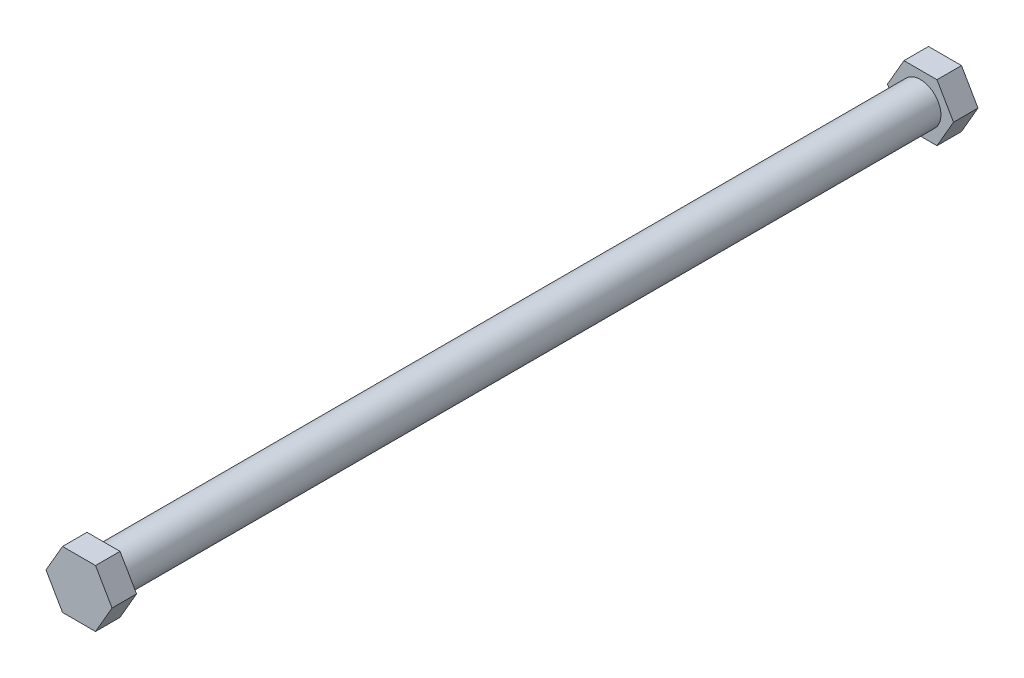
ISO-10303-21;
HEADER;
FILE_DESCRIPTION(('STEP AP214'),'2;1');
FILE_NAME('part.step','',(''),(''),'','','');
FILE_SCHEMA(('AUTOMOTIVE_DESIGN { 1 0 10303 214 1 1 1 1 }'));
ENDSEC;
DATA;
#1=APPLICATION_CONTEXT('core data for automotive mechanical design processes');
#2=APPLICATION_PROTOCOL_DEFINITION('international standard','automotive_design',2000,#1);
#3=PRODUCT_CONTEXT('',#1,'mechanical');
#4=PRODUCT('Part','Part','',(#3));
#5=PRODUCT_RELATED_PRODUCT_CATEGORY('part','',(#4));
#6=PRODUCT_DEFINITION_FORMATION('','',#4);
#7=PRODUCT_DEFINITION_CONTEXT('part definition',#1,'design');
#8=PRODUCT_DEFINITION('design','',#6,#7);
#9=PRODUCT_DEFINITION_SHAPE('','',#8);
#10=(LENGTH_UNIT() NAMED_UNIT(*) SI_UNIT(.MILLI.,.METRE.));
#11=(NAMED_UNIT(*) PLANE_ANGLE_UNIT() SI_UNIT($,.RADIAN.));
#12=(NAMED_UNIT(*) SI_UNIT($,.STERADIAN.) SOLID_ANGLE_UNIT());
#13=UNCERTAINTY_MEASURE_WITH_UNIT(LENGTH_MEASURE(1.E-05),#10,'distance_accuracy_value','');
#14=(GEOMETRIC_REPRESENTATION_CONTEXT(3) GLOBAL_UNCERTAINTY_ASSIGNED_CONTEXT((#13)) GLOBAL_UNIT_ASSIGNED_CONTEXT((#10,
#11,#12)) REPRESENTATION_CONTEXT('',''));
#15=CARTESIAN_POINT('',(0.,0.,0.));
#16=DIRECTION('',(0.,0.,1.));
#17=DIRECTION('',(1.,0.,0.));
#18=AXIS2_PLACEMENT_3D('',#15,#16,#17);
#19=CARTESIAN_POINT('',(0.,0.,100.));
#20=DIRECTION('',(0.,0.,-1.));
#21=DIRECTION('',(-1.,0.,0.));
#22=AXIS2_PLACEMENT_3D('',#19,#20,#21);
#23=CYLINDRICAL_SURFACE('',#22,2.5);
#24=CARTESIAN_POINT('',(0.,0.,100.));
#25=DIRECTION('',(0.,0.,1.));
#26=DIRECTION('',(1.,0.,0.));
#27=AXIS2_PLACEMENT_3D('',#24,#25,#26);
#28=CIRCLE('',#27,2.5);
#29=CARTESIAN_POINT('',(2.5,0.,100.));
#30=VERTEX_POINT('',#29);
#31=EDGE_CURVE('E11',#30,#30,#28,.T.);
#32=ORIENTED_EDGE('',*,*,#31,.F.);
#33=EDGE_LOOP('',(#32));
#34=FACE_BOUND('',#33,.T.);
#35=CARTESIAN_POINT('',(0.,0.,0.));
#36=DIRECTION('',(0.,0.,1.));
#37=DIRECTION('',(1.,0.,0.));
#38=AXIS2_PLACEMENT_3D('',#35,#36,#37);
#39=CIRCLE('',#38,2.5);
#40=CARTESIAN_POINT('',(2.5,0.,0.));
#41=VERTEX_POINT('',#40);
#42=EDGE_CURVE('E42',#41,#41,#39,.T.);
#43=ORIENTED_EDGE('',*,*,#42,.T.);
#44=EDGE_LOOP('',(#43));
#45=FACE_BOUND('',#44,.T.);
#46=ADVANCED_FACE('F39',(#34,#45),#23,.T.);
#47=CARTESIAN_POINT('',(4.04145188432738,0.,-3.));
#48=DIRECTION('',(0.866025403784438,0.5,0.));
#49=DIRECTION('',(-0.5,0.866025403784439,0.));
#50=AXIS2_PLACEMENT_3D('',#47,#48,#49);
#51=PLANE('',#50);
#52=DIRECTION('',(-0.5,0.866025403784439,0.));
#53=VECTOR('',#52,1.);
#54=CARTESIAN_POINT('',(4.04145188432738,0.,0.));
#55=LINE('',#54,#53);
#56=CARTESIAN_POINT('',(4.04145188432738,0.,0.));
#57=VERTEX_POINT('',#56);
#58=CARTESIAN_POINT('',(2.02072594216369,3.5,0.));
#59=VERTEX_POINT('',#58);
#60=EDGE_CURVE('E136',#57,#59,#55,.T.);
#61=ORIENTED_EDGE('',*,*,#60,.F.);
#62=DIRECTION('',(0.,0.,1.));
#63=VECTOR('',#62,1.);
#64=CARTESIAN_POINT('',(4.04145188432738,0.,-3.));
#65=LINE('',#64,#63);
#66=CARTESIAN_POINT('',(4.04145188432738,0.,-3.));
#67=VERTEX_POINT('',#66);
#68=EDGE_CURVE('E56',#67,#57,#65,.T.);
#69=ORIENTED_EDGE('',*,*,#68,.F.);
#70=DIRECTION('',(-0.5,0.866025403784439,0.));
#71=VECTOR('',#70,1.);
#72=CARTESIAN_POINT('',(4.04145188432738,0.,-3.));
#73=LINE('',#72,#71);
#74=CARTESIAN_POINT('',(2.02072594216369,3.5,-3.));
#75=VERTEX_POINT('',#74);
#76=EDGE_CURVE('E158',#67,#75,#73,.T.);
#77=ORIENTED_EDGE('',*,*,#76,.T.);
#78=DIRECTION('',(0.,0.,1.));
#79=VECTOR('',#78,1.);
#80=CARTESIAN_POINT('',(2.02072594216369,3.5,-3.));
#81=LINE('',#80,#79);
#82=EDGE_CURVE('E92',#75,#59,#81,.T.);
#83=ORIENTED_EDGE('',*,*,#82,.T.);
#84=EDGE_LOOP('',(#61,#69,#77,#83));
#85=FACE_BOUND('',#84,.T.);
#86=ADVANCED_FACE('F169',(#85),#51,.T.);
#87=CARTESIAN_POINT('',(2.02072594216369,-3.5,-3.));
#88=DIRECTION('',(0.866025403784439,-0.499999999999999,0.));
#89=DIRECTION('',(0.5,0.866025403784439,0.));
#90=AXIS2_PLACEMENT_3D('',#87,#88,#89);
#91=PLANE('',#90);
#92=DIRECTION('',(0.5,0.866025403784439,0.));
#93=VECTOR('',#92,1.);
#94=CARTESIAN_POINT('',(2.02072594216369,-3.5,0.));
#95=LINE('',#94,#93);
#96=CARTESIAN_POINT('',(2.02072594216369,-3.5,0.));
#97=VERTEX_POINT('',#96);
#98=EDGE_CURVE('E154',#97,#57,#95,.T.);
#99=ORIENTED_EDGE('',*,*,#98,.F.);
#100=DIRECTION('',(0.,0.,1.));
#101=VECTOR('',#100,1.);
#102=CARTESIAN_POINT('',(2.02072594216369,-3.5,-3.));
#103=LINE('',#102,#101);
#104=CARTESIAN_POINT('',(2.02072594216369,-3.5,-3.));
#105=VERTEX_POINT('',#104);
#106=EDGE_CURVE('E80',#105,#97,#103,.T.);
#107=ORIENTED_EDGE('',*,*,#106,.F.);
#108=DIRECTION('',(0.5,0.866025403784439,0.));
#109=VECTOR('',#108,1.);
#110=CARTESIAN_POINT('',(2.02072594216369,-3.5,-3.));
#111=LINE('',#110,#109);
#112=EDGE_CURVE('E122',#105,#67,#111,.T.);
#113=ORIENTED_EDGE('',*,*,#112,.T.);
#114=ORIENTED_EDGE('',*,*,#68,.T.);
#115=EDGE_LOOP('',(#99,#107,#113,#114));
#116=FACE_BOUND('',#115,.T.);
#117=ADVANCED_FACE('F174',(#116),#91,.T.);
#118=CARTESIAN_POINT('',(-2.02072594216369,-3.5,-3.));
#119=DIRECTION('',(0.,-1.,0.));
#120=DIRECTION('',(1.,0.,0.));
#121=AXIS2_PLACEMENT_3D('',#118,#119,#120);
#122=PLANE('',#121);
#123=DIRECTION('',(1.,0.,0.));
#124=VECTOR('',#123,1.);
#125=CARTESIAN_POINT('',(-2.02072594216369,-3.5,0.));
#126=LINE('',#125,#124);
#127=CARTESIAN_POINT('',(-2.02072594216369,-3.5,0.));
#128=VERTEX_POINT('',#127);
#129=EDGE_CURVE('E108',#128,#97,#126,.T.);
#130=ORIENTED_EDGE('',*,*,#129,.F.);
#131=DIRECTION('',(0.,0.,1.));
#132=VECTOR('',#131,1.);
#133=CARTESIAN_POINT('',(-2.02072594216369,-3.5,-3.));
#134=LINE('',#133,#132);
#135=CARTESIAN_POINT('',(-2.02072594216369,-3.5,-3.));
#136=VERTEX_POINT('',#135);
#137=EDGE_CURVE('E103',#136,#128,#134,.T.);
#138=ORIENTED_EDGE('',*,*,#137,.F.);
#139=DIRECTION('',(1.,0.,0.));
#140=VECTOR('',#139,1.);
#141=CARTESIAN_POINT('',(-2.02072594216369,-3.5,-3.));
#142=LINE('',#141,#140);
#143=EDGE_CURVE('E106',#136,#105,#142,.T.);
#144=ORIENTED_EDGE('',*,*,#143,.T.);
#145=ORIENTED_EDGE('',*,*,#106,.T.);
#146=EDGE_LOOP('',(#130,#138,#144,#145));
#147=FACE_BOUND('',#146,.T.);
#148=ADVANCED_FACE('F105',(#147),#122,.T.);
#149=CARTESIAN_POINT('',(-4.04145188432738,0.,-3.));
#150=DIRECTION('',(-0.866025403784439,-0.5,0.));
#151=DIRECTION('',(0.5,-0.866025403784439,0.));
#152=AXIS2_PLACEMENT_3D('',#149,#150,#151);
#153=PLANE('',#152);
#154=DIRECTION('',(0.5,-0.866025403784439,0.));
#155=VECTOR('',#154,1.);
#156=CARTESIAN_POINT('',(-4.04145188432738,0.,0.));
#157=LINE('',#156,#155);
#158=CARTESIAN_POINT('',(-4.04145188432738,0.,0.));
#159=VERTEX_POINT('',#158);
#160=EDGE_CURVE('E149',#159,#128,#157,.T.);
#161=ORIENTED_EDGE('',*,*,#160,.F.);
#162=DIRECTION('',(0.,0.,1.));
#163=VECTOR('',#162,1.);
#164=CARTESIAN_POINT('',(-4.04145188432738,0.,-3.));
#165=LINE('',#164,#163);
#166=CARTESIAN_POINT('',(-4.04145188432738,0.,-3.));
#167=VERTEX_POINT('',#166);
#168=EDGE_CURVE('E114',#167,#159,#165,.T.);
#169=ORIENTED_EDGE('',*,*,#168,.F.);
#170=DIRECTION('',(0.5,-0.866025403784439,0.));
#171=VECTOR('',#170,1.);
#172=CARTESIAN_POINT('',(-4.04145188432738,0.,-3.));
#173=LINE('',#172,#171);
#174=EDGE_CURVE('E120',#167,#136,#173,.T.);
#175=ORIENTED_EDGE('',*,*,#174,.T.);
#176=ORIENTED_EDGE('',*,*,#137,.T.);
#177=EDGE_LOOP('',(#161,#169,#175,#176));
#178=FACE_BOUND('',#177,.T.);
#179=ADVANCED_FACE('F125',(#178),#153,.T.);
#180=CARTESIAN_POINT('',(-2.02072594216369,3.5,-3.));
#181=DIRECTION('',(-0.866025403784439,0.5,0.));
#182=DIRECTION('',(-0.5,-0.866025403784439,0.));
#183=AXIS2_PLACEMENT_3D('',#180,#181,#182);
#184=PLANE('',#183);
#185=DIRECTION('',(-0.5,-0.866025403784439,0.));
#186=VECTOR('',#185,1.);
#187=CARTESIAN_POINT('',(-2.02072594216369,3.5,0.));
#188=LINE('',#187,#186);
#189=CARTESIAN_POINT('',(-2.02072594216369,3.5,0.));
#190=VERTEX_POINT('',#189);
#191=EDGE_CURVE('E145',#190,#159,#188,.T.);
#192=ORIENTED_EDGE('',*,*,#191,.F.);
#193=DIRECTION('',(0.,0.,1.));
#194=VECTOR('',#193,1.);
#195=CARTESIAN_POINT('',(-2.02072594216369,3.5,-3.));
#196=LINE('',#195,#194);
#197=CARTESIAN_POINT('',(-2.02072594216369,3.5,-3.));
#198=VERTEX_POINT('',#197);
#199=EDGE_CURVE('E165',#198,#190,#196,.T.);
#200=ORIENTED_EDGE('',*,*,#199,.F.);
#201=DIRECTION('',(-0.5,-0.866025403784439,0.));
#202=VECTOR('',#201,1.);
#203=CARTESIAN_POINT('',(-2.02072594216369,3.5,-3.));
#204=LINE('',#203,#202);
#205=EDGE_CURVE('E127',#198,#167,#204,.T.);
#206=ORIENTED_EDGE('',*,*,#205,.T.);
#207=ORIENTED_EDGE('',*,*,#168,.T.);
#208=EDGE_LOOP('',(#192,#200,#206,#207));
#209=FACE_BOUND('',#208,.T.);
#210=ADVANCED_FACE('F311',(#209),#184,.T.);
#211=CARTESIAN_POINT('',(2.02072594216369,3.5,-3.));
#212=DIRECTION('',(0.,1.,0.));
#213=DIRECTION('',(0.,0.,1.));
#214=AXIS2_PLACEMENT_3D('',#211,#212,#213);
#215=PLANE('',#214);
#216=DIRECTION('',(-1.,0.,0.));
#217=VECTOR('',#216,1.);
#218=CARTESIAN_POINT('',(2.02072594216369,3.5,0.));
#219=LINE('',#218,#217);
#220=EDGE_CURVE('E140',#59,#190,#219,.T.);
#221=ORIENTED_EDGE('',*,*,#220,.F.);
#222=ORIENTED_EDGE('',*,*,#82,.F.);
#223=DIRECTION('',(-1.,0.,0.));
#224=VECTOR('',#223,1.);
#225=CARTESIAN_POINT('',(2.02072594216369,3.5,-3.));
#226=LINE('',#225,#224);
#227=EDGE_CURVE('E130',#75,#198,#226,.T.);
#228=ORIENTED_EDGE('',*,*,#227,.T.);
#229=ORIENTED_EDGE('',*,*,#199,.T.);
#230=EDGE_LOOP('',(#221,#222,#228,#229));
#231=FACE_BOUND('',#230,.T.);
#232=ADVANCED_FACE('F170',(#231),#215,.T.);
#233=CARTESIAN_POINT('',(0.,0.,-3.));
#234=DIRECTION('',(0.,0.,1.));
#235=DIRECTION('',(1.,0.,0.));
#236=AXIS2_PLACEMENT_3D('',#233,#234,#235);
#237=PLANE('',#236);
#238=ORIENTED_EDGE('',*,*,#76,.F.);
#239=ORIENTED_EDGE('',*,*,#112,.F.);
#240=ORIENTED_EDGE('',*,*,#143,.F.);
#241=ORIENTED_EDGE('',*,*,#174,.F.);
#242=ORIENTED_EDGE('',*,*,#205,.F.);
#243=ORIENTED_EDGE('',*,*,#227,.F.);
#244=EDGE_LOOP('',(#238,#239,#240,#241,#242,#243));
#245=FACE_BOUND('',#244,.T.);
#246=ADVANCED_FACE('F118',(#245),#237,.F.);
#247=CARTESIAN_POINT('',(0.,0.,0.));
#248=DIRECTION('',(0.,0.,1.));
#249=DIRECTION('',(1.,0.,0.));
#250=AXIS2_PLACEMENT_3D('',#247,#248,#249);
#251=PLANE('',#250);
#252=ORIENTED_EDGE('',*,*,#42,.F.);
#253=EDGE_LOOP('',(#252));
#254=FACE_BOUND('',#253,.T.);
#255=ORIENTED_EDGE('',*,*,#60,.T.);
#256=ORIENTED_EDGE('',*,*,#220,.T.);
#257=ORIENTED_EDGE('',*,*,#191,.T.);
#258=ORIENTED_EDGE('',*,*,#160,.T.);
#259=ORIENTED_EDGE('',*,*,#129,.T.);
#260=ORIENTED_EDGE('',*,*,#98,.T.);
#261=EDGE_LOOP('',(#255,#256,#257,#258,#259,#260));
#262=FACE_BOUND('',#261,.T.);
#263=ADVANCED_FACE('F173',(#254,#262),#251,.T.);
#264=CARTESIAN_POINT('',(3.03108891324554,1.75,103.));
#265=DIRECTION('',(0.866025403784438,0.5,0.));
#266=DIRECTION('',(-0.5,0.866025403784439,0.));
#267=AXIS2_PLACEMENT_3D('',#264,#265,#266);
#268=PLANE('',#267);
#269=DIRECTION('',(0.5,-0.866025403784439,0.));
#270=VECTOR('',#269,1.);
#271=CARTESIAN_POINT('',(3.03108891324554,1.75,100.));
#272=LINE('',#271,#270);
#273=CARTESIAN_POINT('',(2.02072594216369,3.5,100.));
#274=VERTEX_POINT('',#273);
#275=CARTESIAN_POINT('',(4.04145188432738,0.,100.));
#276=VERTEX_POINT('',#275);
#277=EDGE_CURVE('E270',#274,#276,#272,.T.);
#278=ORIENTED_EDGE('',*,*,#277,.F.);
#279=DIRECTION('',(0.,0.,-1.));
#280=VECTOR('',#279,1.);
#281=CARTESIAN_POINT('',(2.02072594216369,3.5,103.));
#282=LINE('',#281,#280);
#283=CARTESIAN_POINT('',(2.02072594216369,3.5,103.));
#284=VERTEX_POINT('',#283);
#285=EDGE_CURVE('E141',#284,#274,#282,.T.);
#286=ORIENTED_EDGE('',*,*,#285,.F.);
#287=DIRECTION('',(0.5,-0.866025403784439,0.));
#288=VECTOR('',#287,1.);
#289=CARTESIAN_POINT('',(3.03108891324554,1.75,103.));
#290=LINE('',#289,#288);
#291=CARTESIAN_POINT('',(4.04145188432738,0.,103.));
#292=VERTEX_POINT('',#291);
#293=EDGE_CURVE('E236',#284,#292,#290,.T.);
#294=ORIENTED_EDGE('',*,*,#293,.T.);
#295=DIRECTION('',(0.,0.,-1.));
#296=VECTOR('',#295,1.);
#297=CARTESIAN_POINT('',(4.04145188432738,0.,103.));
#298=LINE('',#297,#296);
#299=EDGE_CURVE('E259',#292,#276,#298,.T.);
#300=ORIENTED_EDGE('',*,*,#299,.T.);
#301=EDGE_LOOP('',(#278,#286,#294,#300));
#302=FACE_BOUND('',#301,.T.);
#303=ADVANCED_FACE('F194',(#302),#268,.T.);
#304=CARTESIAN_POINT('',(0.,3.5,103.));
#305=DIRECTION('',(0.,1.,0.));
#306=DIRECTION('',(0.,0.,1.));
#307=AXIS2_PLACEMENT_3D('',#304,#305,#306);
#308=PLANE('',#307);
#309=DIRECTION('',(1.,0.,0.));
#310=VECTOR('',#309,1.);
#311=CARTESIAN_POINT('',(0.,3.5,100.));
#312=LINE('',#311,#310);
#313=CARTESIAN_POINT('',(-2.02072594216369,3.5,100.));
#314=VERTEX_POINT('',#313);
#315=EDGE_CURVE('E249',#314,#274,#312,.T.);
#316=ORIENTED_EDGE('',*,*,#315,.F.);
#317=DIRECTION('',(0.,0.,-1.));
#318=VECTOR('',#317,1.);
#319=CARTESIAN_POINT('',(-2.02072594216369,3.5,103.));
#320=LINE('',#319,#318);
#321=CARTESIAN_POINT('',(-2.02072594216369,3.5,103.));
#322=VERTEX_POINT('',#321);
#323=EDGE_CURVE('E256',#322,#314,#320,.T.);
#324=ORIENTED_EDGE('',*,*,#323,.F.);
#325=DIRECTION('',(1.,0.,0.));
#326=VECTOR('',#325,1.);
#327=CARTESIAN_POINT('',(0.,3.5,103.));
#328=LINE('',#327,#326);
#329=EDGE_CURVE('E240',#322,#284,#328,.T.);
#330=ORIENTED_EDGE('',*,*,#329,.T.);
#331=ORIENTED_EDGE('',*,*,#285,.T.);
#332=EDGE_LOOP('',(#316,#324,#330,#331));
#333=FACE_BOUND('',#332,.T.);
#334=ADVANCED_FACE('F199',(#333),#308,.T.);
#335=CARTESIAN_POINT('',(-3.03108891324554,1.75,103.));
#336=DIRECTION('',(-0.866025403784439,0.5,0.));
#337=DIRECTION('',(-0.5,-0.866025403784439,0.));
#338=AXIS2_PLACEMENT_3D('',#335,#336,#337);
#339=PLANE('',#338);
#340=DIRECTION('',(0.5,0.866025403784439,0.));
#341=VECTOR('',#340,1.);
#342=CARTESIAN_POINT('',(-3.03108891324554,1.75,100.));
#343=LINE('',#342,#341);
#344=CARTESIAN_POINT('',(-4.04145188432738,0.,100.));
#345=VERTEX_POINT('',#344);
#346=EDGE_CURVE('E286',#345,#314,#343,.T.);
#347=ORIENTED_EDGE('',*,*,#346,.F.);
#348=DIRECTION('',(0.,0.,-1.));
#349=VECTOR('',#348,1.);
#350=CARTESIAN_POINT('',(-4.04145188432738,0.,103.));
#351=LINE('',#350,#349);
#352=CARTESIAN_POINT('',(-4.04145188432738,0.,103.));
#353=VERTEX_POINT('',#352);
#354=EDGE_CURVE('E297',#353,#345,#351,.T.);
#355=ORIENTED_EDGE('',*,*,#354,.F.);
#356=DIRECTION('',(0.5,0.866025403784439,0.));
#357=VECTOR('',#356,1.);
#358=CARTESIAN_POINT('',(-3.03108891324554,1.75,103.));
#359=LINE('',#358,#357);
#360=EDGE_CURVE('E260',#353,#322,#359,.T.);
#361=ORIENTED_EDGE('',*,*,#360,.T.);
#362=ORIENTED_EDGE('',*,*,#323,.T.);
#363=EDGE_LOOP('',(#347,#355,#361,#362));
#364=FACE_BOUND('',#363,.T.);
#365=ADVANCED_FACE('F216',(#364),#339,.T.);
#366=CARTESIAN_POINT('',(-3.03108891324554,-1.75,103.));
#367=DIRECTION('',(-0.866025403784438,-0.5,0.));
#368=DIRECTION('',(0.5,-0.866025403784439,0.));
#369=AXIS2_PLACEMENT_3D('',#366,#367,#368);
#370=PLANE('',#369);
#371=DIRECTION('',(-0.5,0.866025403784439,0.));
#372=VECTOR('',#371,1.);
#373=CARTESIAN_POINT('',(-3.03108891324554,-1.75,100.));
#374=LINE('',#373,#372);
#375=CARTESIAN_POINT('',(-2.02072594216369,-3.5,100.));
#376=VERTEX_POINT('',#375);
#377=EDGE_CURVE('E282',#376,#345,#374,.T.);
#378=ORIENTED_EDGE('',*,*,#377,.F.);
#379=DIRECTION('',(0.,0.,-1.));
#380=VECTOR('',#379,1.);
#381=CARTESIAN_POINT('',(-2.02072594216369,-3.5,103.));
#382=LINE('',#381,#380);
#383=CARTESIAN_POINT('',(-2.02072594216369,-3.5,103.));
#384=VERTEX_POINT('',#383);
#385=EDGE_CURVE('E301',#384,#376,#382,.T.);
#386=ORIENTED_EDGE('',*,*,#385,.F.);
#387=DIRECTION('',(-0.5,0.866025403784439,0.));
#388=VECTOR('',#387,1.);
#389=CARTESIAN_POINT('',(-3.03108891324554,-1.75,103.));
#390=LINE('',#389,#388);
#391=EDGE_CURVE('E266',#384,#353,#390,.T.);
#392=ORIENTED_EDGE('',*,*,#391,.T.);
#393=ORIENTED_EDGE('',*,*,#354,.T.);
#394=EDGE_LOOP('',(#378,#386,#392,#393));
#395=FACE_BOUND('',#394,.T.);
#396=ADVANCED_FACE('F212',(#395),#370,.T.);
#397=CARTESIAN_POINT('',(0.,-3.5,103.));
#398=DIRECTION('',(0.,-1.,0.));
#399=DIRECTION('',(1.,0.,0.));
#400=AXIS2_PLACEMENT_3D('',#397,#398,#399);
#401=PLANE('',#400);
#402=DIRECTION('',(-1.,0.,0.));
#403=VECTOR('',#402,1.);
#404=CARTESIAN_POINT('',(0.,-3.5,100.));
#405=LINE('',#404,#403);
#406=CARTESIAN_POINT('',(2.02072594216369,-3.5,100.));
#407=VERTEX_POINT('',#406);
#408=EDGE_CURVE('E278',#407,#376,#405,.T.);
#409=ORIENTED_EDGE('',*,*,#408,.F.);
#410=DIRECTION('',(0.,0.,-1.));
#411=VECTOR('',#410,1.);
#412=CARTESIAN_POINT('',(2.02072594216369,-3.5,103.));
#413=LINE('',#412,#411);
#414=CARTESIAN_POINT('',(2.02072594216369,-3.5,103.));
#415=VERTEX_POINT('',#414);
#416=EDGE_CURVE('E264',#415,#407,#413,.T.);
#417=ORIENTED_EDGE('',*,*,#416,.F.);
#418=DIRECTION('',(-1.,0.,0.));
#419=VECTOR('',#418,1.);
#420=CARTESIAN_POINT('',(0.,-3.5,103.));
#421=LINE('',#420,#419);
#422=EDGE_CURVE('E441',#415,#384,#421,.T.);
#423=ORIENTED_EDGE('',*,*,#422,.T.);
#424=ORIENTED_EDGE('',*,*,#385,.T.);
#425=EDGE_LOOP('',(#409,#417,#423,#424));
#426=FACE_BOUND('',#425,.T.);
#427=ADVANCED_FACE('F208',(#426),#401,.T.);
#428=CARTESIAN_POINT('',(3.03108891324554,-1.75,103.));
#429=DIRECTION('',(0.866025403784439,-0.5,0.));
#430=DIRECTION('',(0.5,0.866025403784439,0.));
#431=AXIS2_PLACEMENT_3D('',#428,#429,#430);
#432=PLANE('',#431);
#433=DIRECTION('',(-0.5,-0.866025403784439,0.));
#434=VECTOR('',#433,1.);
#435=CARTESIAN_POINT('',(3.03108891324554,-1.75,100.));
#436=LINE('',#435,#434);
#437=EDGE_CURVE('E274',#276,#407,#436,.T.);
#438=ORIENTED_EDGE('',*,*,#437,.F.);
#439=ORIENTED_EDGE('',*,*,#299,.F.);
#440=DIRECTION('',(-0.5,-0.866025403784439,0.));
#441=VECTOR('',#440,1.);
#442=CARTESIAN_POINT('',(3.03108891324554,-1.75,103.));
#443=LINE('',#442,#441);
#444=EDGE_CURVE('E244',#292,#415,#443,.T.);
#445=ORIENTED_EDGE('',*,*,#444,.T.);
#446=ORIENTED_EDGE('',*,*,#416,.T.);
#447=EDGE_LOOP('',(#438,#439,#445,#446));
#448=FACE_BOUND('',#447,.T.);
#449=ADVANCED_FACE('F204',(#448),#432,.T.);
#450=CARTESIAN_POINT('',(0.,0.,103.));
#451=DIRECTION('',(0.,0.,-1.));
#452=DIRECTION('',(-1.,0.,0.));
#453=AXIS2_PLACEMENT_3D('',#450,#451,#452);
#454=PLANE('',#453);
#455=ORIENTED_EDGE('',*,*,#293,.F.);
#456=ORIENTED_EDGE('',*,*,#329,.F.);
#457=ORIENTED_EDGE('',*,*,#360,.F.);
#458=ORIENTED_EDGE('',*,*,#391,.F.);
#459=ORIENTED_EDGE('',*,*,#422,.F.);
#460=ORIENTED_EDGE('',*,*,#444,.F.);
#461=EDGE_LOOP('',(#455,#456,#457,#458,#459,#460));
#462=FACE_BOUND('',#461,.T.);
#463=ADVANCED_FACE('F207',(#462),#454,.F.);
#464=CARTESIAN_POINT('',(0.,0.,100.));
#465=DIRECTION('',(0.,0.,-1.));
#466=DIRECTION('',(-1.,0.,0.));
#467=AXIS2_PLACEMENT_3D('',#464,#465,#466);
#468=PLANE('',#467);
#469=ORIENTED_EDGE('',*,*,#31,.T.);
#470=EDGE_LOOP('',(#469));
#471=FACE_BOUND('',#470,.T.);
#472=ORIENTED_EDGE('',*,*,#277,.T.);
#473=ORIENTED_EDGE('',*,*,#437,.T.);
#474=ORIENTED_EDGE('',*,*,#408,.T.);
#475=ORIENTED_EDGE('',*,*,#377,.T.);
#476=ORIENTED_EDGE('',*,*,#346,.T.);
#477=ORIENTED_EDGE('',*,*,#315,.T.);
#478=EDGE_LOOP('',(#472,#473,#474,#475,#476,#477));
#479=FACE_BOUND('',#478,.T.);
#480=ADVANCED_FACE('F224',(#471,#479),#468,.T.);
#481=CLOSED_SHELL('',(#46,#86,#117,#148,#179,#210,#232,#246,#263,#303,#334,#365,#396,#427,#449,
#463,#480));
#482=MANIFOLD_SOLID_BREP('B2',#481);
#483=ADVANCED_BREP_SHAPE_REPRESENTATION('',(#18,#482),#14);
#484=SHAPE_DEFINITION_REPRESENTATION(#9,#483);
ENDSEC;
END-ISO-10303-21;
